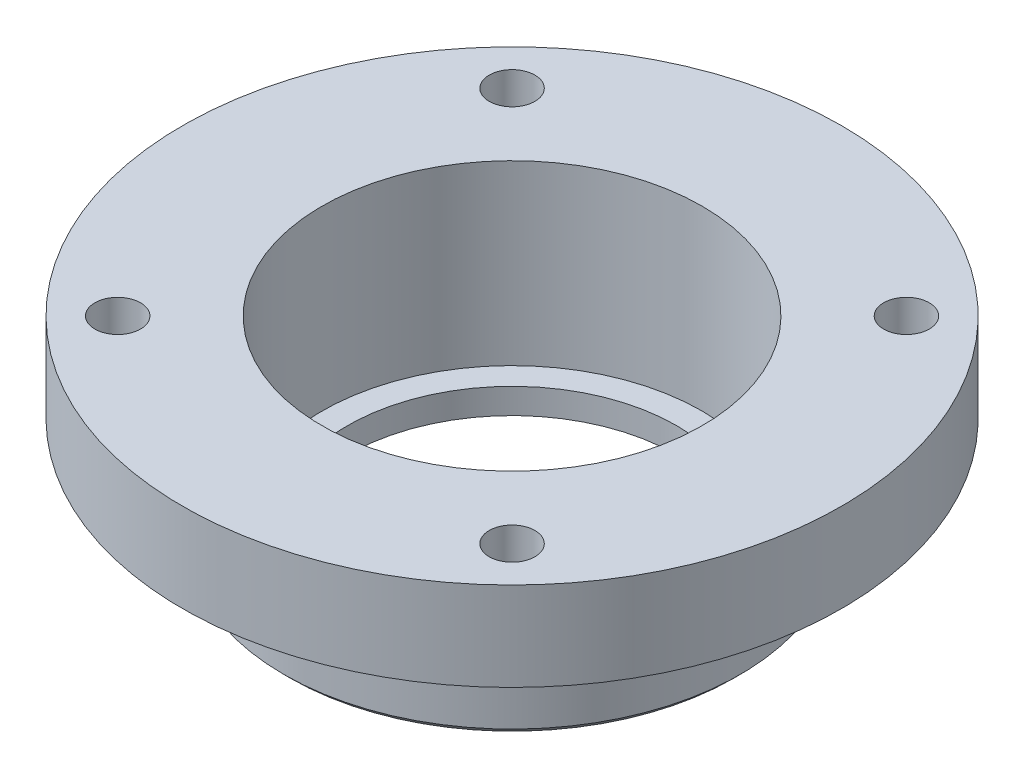
ISO-10303-21;
HEADER;
FILE_DESCRIPTION(('STEP AP214'),'2;1');
FILE_NAME('part.step','',(''),(''),'','','');
FILE_SCHEMA(('AUTOMOTIVE_DESIGN { 1 0 10303 214 1 1 1 1 }'));
ENDSEC;
DATA;
#1=APPLICATION_CONTEXT('core data for automotive mechanical design processes');
#2=APPLICATION_PROTOCOL_DEFINITION('international standard','automotive_design',2000,#1);
#3=PRODUCT_CONTEXT('',#1,'mechanical');
#4=PRODUCT('Part','Part','',(#3));
#5=PRODUCT_RELATED_PRODUCT_CATEGORY('part','',(#4));
#6=PRODUCT_DEFINITION_FORMATION('','',#4);
#7=PRODUCT_DEFINITION_CONTEXT('part definition',#1,'design');
#8=PRODUCT_DEFINITION('design','',#6,#7);
#9=PRODUCT_DEFINITION_SHAPE('','',#8);
#10=(LENGTH_UNIT() NAMED_UNIT(*) SI_UNIT(.MILLI.,.METRE.));
#11=(NAMED_UNIT(*) PLANE_ANGLE_UNIT() SI_UNIT($,.RADIAN.));
#12=(NAMED_UNIT(*) SI_UNIT($,.STERADIAN.) SOLID_ANGLE_UNIT());
#13=UNCERTAINTY_MEASURE_WITH_UNIT(LENGTH_MEASURE(1.E-05),#10,'distance_accuracy_value','');
#14=(GEOMETRIC_REPRESENTATION_CONTEXT(3) GLOBAL_UNCERTAINTY_ASSIGNED_CONTEXT((#13)) GLOBAL_UNIT_ASSIGNED_CONTEXT((#10,
#11,#12)) REPRESENTATION_CONTEXT('',''));
#15=CARTESIAN_POINT('',(0.,0.,0.));
#16=DIRECTION('',(0.,0.,1.));
#17=DIRECTION('',(1.,0.,0.));
#18=AXIS2_PLACEMENT_3D('',#15,#16,#17);
#19=CARTESIAN_POINT('',(-15.,16.,0.));
#20=DIRECTION('',(0.,-1.,0.));
#21=DIRECTION('',(0.,0.,-1.));
#22=AXIS2_PLACEMENT_3D('',#19,#20,#21);
#23=PLANE('',#22);
#24=CARTESIAN_POINT('',(15.556349186104,16.,-15.5563491861041));
#25=DIRECTION('',(0.,1.,0.));
#26=DIRECTION('',(0.,0.,1.));
#27=AXIS2_PLACEMENT_3D('',#24,#25,#26);
#28=CIRCLE('',#27,1.8);
#29=CARTESIAN_POINT('',(15.556349186104,16.,-13.7563491861041));
#30=VERTEX_POINT('',#29);
#31=EDGE_CURVE('E80',#30,#30,#28,.T.);
#32=ORIENTED_EDGE('',*,*,#31,.F.);
#33=EDGE_LOOP('',(#32));
#34=FACE_BOUND('',#33,.T.);
#35=CARTESIAN_POINT('',(15.556349186104,16.,15.5563491861041));
#36=DIRECTION('',(0.,1.,0.));
#37=DIRECTION('',(0.,0.,1.));
#38=AXIS2_PLACEMENT_3D('',#35,#36,#37);
#39=CIRCLE('',#38,1.8);
#40=CARTESIAN_POINT('',(15.556349186104,16.,17.3563491861041));
#41=VERTEX_POINT('',#40);
#42=EDGE_CURVE('E74',#41,#41,#39,.T.);
#43=ORIENTED_EDGE('',*,*,#42,.F.);
#44=EDGE_LOOP('',(#43));
#45=FACE_BOUND('',#44,.T.);
#46=CARTESIAN_POINT('',(0.,16.,0.));
#47=DIRECTION('',(0.,-1.,0.));
#48=DIRECTION('',(0.,0.,-1.));
#49=AXIS2_PLACEMENT_3D('',#46,#47,#48);
#50=CIRCLE('',#49,26.);
#51=CARTESIAN_POINT('',(0.,16.,-26.));
#52=VERTEX_POINT('',#51);
#53=EDGE_CURVE('E62',#52,#52,#50,.T.);
#54=ORIENTED_EDGE('',*,*,#53,.F.);
#55=EDGE_LOOP('',(#54));
#56=FACE_BOUND('',#55,.T.);
#57=CARTESIAN_POINT('',(0.,16.,0.));
#58=DIRECTION('',(0.,-1.,0.));
#59=DIRECTION('',(0.,0.,-1.));
#60=AXIS2_PLACEMENT_3D('',#57,#58,#59);
#61=CIRCLE('',#60,15.);
#62=CARTESIAN_POINT('',(0.,16.,-15.));
#63=VERTEX_POINT('',#62);
#64=EDGE_CURVE('E65',#63,#63,#61,.T.);
#65=ORIENTED_EDGE('',*,*,#64,.T.);
#66=EDGE_LOOP('',(#65));
#67=FACE_BOUND('',#66,.T.);
#68=CARTESIAN_POINT('',(-15.556349186104,16.,-15.5563491861041));
#69=DIRECTION('',(0.,1.,0.));
#70=DIRECTION('',(0.,0.,1.));
#71=AXIS2_PLACEMENT_3D('',#68,#69,#70);
#72=CIRCLE('',#71,1.8);
#73=CARTESIAN_POINT('',(-15.556349186104,16.,-13.7563491861041));
#74=VERTEX_POINT('',#73);
#75=EDGE_CURVE('E86',#74,#74,#72,.T.);
#76=ORIENTED_EDGE('',*,*,#75,.F.);
#77=EDGE_LOOP('',(#76));
#78=FACE_BOUND('',#77,.T.);
#79=CARTESIAN_POINT('',(-15.5563491861039,16.,15.5563491861042));
#80=DIRECTION('',(0.,1.,0.));
#81=DIRECTION('',(0.,0.,1.));
#82=AXIS2_PLACEMENT_3D('',#79,#80,#81);
#83=CIRCLE('',#82,1.8);
#84=CARTESIAN_POINT('',(-15.5563491861039,16.,17.3563491861042));
#85=VERTEX_POINT('',#84);
#86=EDGE_CURVE('E92',#85,#85,#83,.T.);
#87=ORIENTED_EDGE('',*,*,#86,.F.);
#88=EDGE_LOOP('',(#87));
#89=FACE_BOUND('',#88,.T.);
#90=ADVANCED_FACE('F35',(#34,#45,#56,#67,#78,#89),#23,.F.);
#91=CARTESIAN_POINT('',(-13.,2.,0.));
#92=DIRECTION('',(0.,-1.,0.));
#93=DIRECTION('',(0.,0.,-1.));
#94=AXIS2_PLACEMENT_3D('',#91,#92,#93);
#95=PLANE('',#94);
#96=CARTESIAN_POINT('',(0.,2.,0.));
#97=DIRECTION('',(0.,-1.,0.));
#98=DIRECTION('',(0.,0.,-1.));
#99=AXIS2_PLACEMENT_3D('',#96,#97,#98);
#100=CIRCLE('',#99,15.);
#101=CARTESIAN_POINT('',(0.,2.,-15.));
#102=VERTEX_POINT('',#101);
#103=EDGE_CURVE('E68',#102,#102,#100,.T.);
#104=ORIENTED_EDGE('',*,*,#103,.F.);
#105=EDGE_LOOP('',(#104));
#106=FACE_BOUND('',#105,.T.);
#107=CARTESIAN_POINT('',(0.,2.,0.));
#108=DIRECTION('',(0.,-1.,0.));
#109=DIRECTION('',(0.,0.,-1.));
#110=AXIS2_PLACEMENT_3D('',#107,#108,#109);
#111=CIRCLE('',#110,13.);
#112=CARTESIAN_POINT('',(0.,2.,-13.));
#113=VERTEX_POINT('',#112);
#114=EDGE_CURVE('E47',#113,#113,#111,.T.);
#115=ORIENTED_EDGE('',*,*,#114,.T.);
#116=EDGE_LOOP('',(#115));
#117=FACE_BOUND('',#116,.T.);
#118=ADVANCED_FACE('F99',(#106,#117),#95,.F.);
#119=CARTESIAN_POINT('',(0.,0.,0.));
#120=DIRECTION('',(0.,-1.,0.));
#121=DIRECTION('',(0.,0.,-1.));
#122=AXIS2_PLACEMENT_3D('',#119,#120,#121);
#123=CYLINDRICAL_SURFACE('',#122,13.);
#124=ORIENTED_EDGE('',*,*,#114,.F.);
#125=EDGE_LOOP('',(#124));
#126=FACE_BOUND('',#125,.T.);
#127=CARTESIAN_POINT('',(0.,0.,0.));
#128=DIRECTION('',(0.,-1.,0.));
#129=DIRECTION('',(0.,0.,-1.));
#130=AXIS2_PLACEMENT_3D('',#127,#128,#129);
#131=CIRCLE('',#130,13.);
#132=CARTESIAN_POINT('',(0.,0.,-13.));
#133=VERTEX_POINT('',#132);
#134=EDGE_CURVE('E51',#133,#133,#131,.T.);
#135=ORIENTED_EDGE('',*,*,#134,.T.);
#136=EDGE_LOOP('',(#135));
#137=FACE_BOUND('',#136,.T.);
#138=ADVANCED_FACE('F105',(#126,#137),#123,.F.);
#139=CARTESIAN_POINT('',(-18.,0.,0.));
#140=DIRECTION('',(0.,1.,0.));
#141=DIRECTION('',(0.,0.,1.));
#142=AXIS2_PLACEMENT_3D('',#139,#140,#141);
#143=PLANE('',#142);
#144=CARTESIAN_POINT('',(0.,0.,0.));
#145=DIRECTION('',(0.,1.,0.));
#146=DIRECTION('',(0.,0.,1.));
#147=AXIS2_PLACEMENT_3D('',#144,#145,#146);
#148=CIRCLE('',#147,17.5);
#149=CARTESIAN_POINT('',(0.,0.,17.5));
#150=VERTEX_POINT('',#149);
#151=EDGE_CURVE('E43',#150,#150,#148,.F.);
#152=ORIENTED_EDGE('',*,*,#151,.T.);
#153=EDGE_LOOP('',(#152));
#154=FACE_BOUND('',#153,.T.);
#155=ORIENTED_EDGE('',*,*,#134,.F.);
#156=EDGE_LOOP('',(#155));
#157=FACE_BOUND('',#156,.T.);
#158=ADVANCED_FACE('F124',(#154,#157),#143,.F.);
#159=CARTESIAN_POINT('',(0.,0.,0.));
#160=DIRECTION('',(0.,-1.,0.));
#161=DIRECTION('',(0.,0.,-1.));
#162=AXIS2_PLACEMENT_3D('',#159,#160,#161);
#163=CYLINDRICAL_SURFACE('',#162,18.);
#164=CARTESIAN_POINT('',(0.,0.500000000000004,0.));
#165=DIRECTION('',(0.,1.,0.));
#166=DIRECTION('',(0.,0.,1.));
#167=AXIS2_PLACEMENT_3D('',#164,#165,#166);
#168=CIRCLE('',#167,18.);
#169=CARTESIAN_POINT('',(0.,0.500000000000004,18.));
#170=VERTEX_POINT('',#169);
#171=EDGE_CURVE('E10',#170,#170,#168,.T.);
#172=ORIENTED_EDGE('',*,*,#171,.T.);
#173=EDGE_LOOP('',(#172));
#174=FACE_BOUND('',#173,.T.);
#175=CARTESIAN_POINT('',(0.,8.99999999999995,0.));
#176=DIRECTION('',(0.,-1.,0.));
#177=DIRECTION('',(0.,0.,-1.));
#178=AXIS2_PLACEMENT_3D('',#175,#176,#177);
#179=CIRCLE('',#178,18.);
#180=CARTESIAN_POINT('',(0.,8.99999999999995,-18.));
#181=VERTEX_POINT('',#180);
#182=EDGE_CURVE('E56',#181,#181,#179,.T.);
#183=ORIENTED_EDGE('',*,*,#182,.T.);
#184=EDGE_LOOP('',(#183));
#185=FACE_BOUND('',#184,.T.);
#186=ADVANCED_FACE('F120',(#174,#185),#163,.T.);
#187=CARTESIAN_POINT('',(-26.,8.99999999999995,0.));
#188=DIRECTION('',(0.,1.,0.));
#189=DIRECTION('',(0.,0.,1.));
#190=AXIS2_PLACEMENT_3D('',#187,#188,#189);
#191=PLANE('',#190);
#192=CARTESIAN_POINT('',(-15.5563491861039,8.99999999999995,15.5563491861042));
#193=DIRECTION('',(0.,1.,0.));
#194=DIRECTION('',(0.,0.,1.));
#195=AXIS2_PLACEMENT_3D('',#192,#193,#194);
#196=CIRCLE('',#195,1.8);
#197=CARTESIAN_POINT('',(-15.5563491861039,8.99999999999995,17.3563491861042));
#198=VERTEX_POINT('',#197);
#199=EDGE_CURVE('E89',#198,#198,#196,.T.);
#200=ORIENTED_EDGE('',*,*,#199,.T.);
#201=EDGE_LOOP('',(#200));
#202=FACE_BOUND('',#201,.T.);
#203=CARTESIAN_POINT('',(-15.556349186104,8.99999999999995,-15.5563491861041));
#204=DIRECTION('',(0.,1.,0.));
#205=DIRECTION('',(0.,0.,1.));
#206=AXIS2_PLACEMENT_3D('',#203,#204,#205);
#207=CIRCLE('',#206,1.8);
#208=CARTESIAN_POINT('',(-15.556349186104,8.99999999999995,-13.7563491861041));
#209=VERTEX_POINT('',#208);
#210=EDGE_CURVE('E83',#209,#209,#207,.T.);
#211=ORIENTED_EDGE('',*,*,#210,.T.);
#212=EDGE_LOOP('',(#211));
#213=FACE_BOUND('',#212,.T.);
#214=CARTESIAN_POINT('',(15.556349186104,8.99999999999995,-15.5563491861041));
#215=DIRECTION('',(0.,1.,0.));
#216=DIRECTION('',(0.,0.,1.));
#217=AXIS2_PLACEMENT_3D('',#214,#215,#216);
#218=CIRCLE('',#217,1.8);
#219=CARTESIAN_POINT('',(15.556349186104,8.99999999999995,-13.7563491861041));
#220=VERTEX_POINT('',#219);
#221=EDGE_CURVE('E77',#220,#220,#218,.T.);
#222=ORIENTED_EDGE('',*,*,#221,.T.);
#223=EDGE_LOOP('',(#222));
#224=FACE_BOUND('',#223,.T.);
#225=CARTESIAN_POINT('',(15.556349186104,8.99999999999995,15.5563491861041));
#226=DIRECTION('',(0.,1.,0.));
#227=DIRECTION('',(0.,0.,1.));
#228=AXIS2_PLACEMENT_3D('',#225,#226,#227);
#229=CIRCLE('',#228,1.8);
#230=CARTESIAN_POINT('',(15.556349186104,8.99999999999995,17.3563491861041));
#231=VERTEX_POINT('',#230);
#232=EDGE_CURVE('E71',#231,#231,#229,.T.);
#233=ORIENTED_EDGE('',*,*,#232,.T.);
#234=EDGE_LOOP('',(#233));
#235=FACE_BOUND('',#234,.T.);
#236=ORIENTED_EDGE('',*,*,#182,.F.);
#237=EDGE_LOOP('',(#236));
#238=FACE_BOUND('',#237,.T.);
#239=CARTESIAN_POINT('',(0.,8.99999999999995,0.));
#240=DIRECTION('',(0.,-1.,0.));
#241=DIRECTION('',(0.,0.,-1.));
#242=AXIS2_PLACEMENT_3D('',#239,#240,#241);
#243=CIRCLE('',#242,26.);
#244=CARTESIAN_POINT('',(0.,8.99999999999995,-26.));
#245=VERTEX_POINT('',#244);
#246=EDGE_CURVE('E59',#245,#245,#243,.T.);
#247=ORIENTED_EDGE('',*,*,#246,.T.);
#248=EDGE_LOOP('',(#247));
#249=FACE_BOUND('',#248,.T.);
#250=ADVANCED_FACE('F116',(#202,#213,#224,#235,#238,#249),#191,.F.);
#251=CARTESIAN_POINT('',(0.,0.,0.));
#252=DIRECTION('',(0.,-1.,0.));
#253=DIRECTION('',(0.,0.,-1.));
#254=AXIS2_PLACEMENT_3D('',#251,#252,#253);
#255=CYLINDRICAL_SURFACE('',#254,26.);
#256=ORIENTED_EDGE('',*,*,#246,.F.);
#257=EDGE_LOOP('',(#256));
#258=FACE_BOUND('',#257,.T.);
#259=ORIENTED_EDGE('',*,*,#53,.T.);
#260=EDGE_LOOP('',(#259));
#261=FACE_BOUND('',#260,.T.);
#262=ADVANCED_FACE('F113',(#258,#261),#255,.T.);
#263=CARTESIAN_POINT('',(0.,0.,0.));
#264=DIRECTION('',(0.,-1.,0.));
#265=DIRECTION('',(0.,0.,-1.));
#266=AXIS2_PLACEMENT_3D('',#263,#264,#265);
#267=CYLINDRICAL_SURFACE('',#266,15.);
#268=ORIENTED_EDGE('',*,*,#64,.F.);
#269=EDGE_LOOP('',(#268));
#270=FACE_BOUND('',#269,.T.);
#271=ORIENTED_EDGE('',*,*,#103,.T.);
#272=EDGE_LOOP('',(#271));
#273=FACE_BOUND('',#272,.T.);
#274=ADVANCED_FACE('F111',(#270,#273),#267,.F.);
#275=CARTESIAN_POINT('',(0.,0.,0.));
#276=DIRECTION('',(0.,1.,0.));
#277=DIRECTION('',(0.,0.,1.));
#278=AXIS2_PLACEMENT_3D('',#275,#276,#277);
#279=CONICAL_SURFACE('',#278,17.5,0.785398163397434);
#280=ORIENTED_EDGE('',*,*,#171,.F.);
#281=EDGE_LOOP('',(#280));
#282=FACE_BOUND('',#281,.T.);
#283=ORIENTED_EDGE('',*,*,#151,.F.);
#284=EDGE_LOOP('',(#283));
#285=FACE_BOUND('',#284,.T.);
#286=ADVANCED_FACE('F38',(#282,#285),#279,.T.);
#287=CARTESIAN_POINT('',(15.556349186104,16.,15.5563491861041));
#288=DIRECTION('',(0.,1.,0.));
#289=DIRECTION('',(0.,0.,1.));
#290=AXIS2_PLACEMENT_3D('',#287,#288,#289);
#291=CYLINDRICAL_SURFACE('',#290,1.8);
#292=ORIENTED_EDGE('',*,*,#232,.F.);
#293=EDGE_LOOP('',(#292));
#294=FACE_BOUND('',#293,.T.);
#295=ORIENTED_EDGE('',*,*,#42,.T.);
#296=EDGE_LOOP('',(#295));
#297=FACE_BOUND('',#296,.T.);
#298=ADVANCED_FACE('F167',(#294,#297),#291,.F.);
#299=CARTESIAN_POINT('',(15.556349186104,16.,-15.5563491861041));
#300=DIRECTION('',(0.,1.,0.));
#301=DIRECTION('',(0.,0.,1.));
#302=AXIS2_PLACEMENT_3D('',#299,#300,#301);
#303=CYLINDRICAL_SURFACE('',#302,1.8);
#304=ORIENTED_EDGE('',*,*,#221,.F.);
#305=EDGE_LOOP('',(#304));
#306=FACE_BOUND('',#305,.T.);
#307=ORIENTED_EDGE('',*,*,#31,.T.);
#308=EDGE_LOOP('',(#307));
#309=FACE_BOUND('',#308,.T.);
#310=ADVANCED_FACE('F174',(#306,#309),#303,.F.);
#311=CARTESIAN_POINT('',(-15.556349186104,16.,-15.5563491861041));
#312=DIRECTION('',(0.,1.,0.));
#313=DIRECTION('',(0.,0.,1.));
#314=AXIS2_PLACEMENT_3D('',#311,#312,#313);
#315=CYLINDRICAL_SURFACE('',#314,1.8);
#316=ORIENTED_EDGE('',*,*,#210,.F.);
#317=EDGE_LOOP('',(#316));
#318=FACE_BOUND('',#317,.T.);
#319=ORIENTED_EDGE('',*,*,#75,.T.);
#320=EDGE_LOOP('',(#319));
#321=FACE_BOUND('',#320,.T.);
#322=ADVANCED_FACE('F180',(#318,#321),#315,.F.);
#323=CARTESIAN_POINT('',(-15.5563491861039,16.,15.5563491861042));
#324=DIRECTION('',(0.,1.,0.));
#325=DIRECTION('',(0.,0.,1.));
#326=AXIS2_PLACEMENT_3D('',#323,#324,#325);
#327=CYLINDRICAL_SURFACE('',#326,1.8);
#328=ORIENTED_EDGE('',*,*,#199,.F.);
#329=EDGE_LOOP('',(#328));
#330=FACE_BOUND('',#329,.T.);
#331=ORIENTED_EDGE('',*,*,#86,.T.);
#332=EDGE_LOOP('',(#331));
#333=FACE_BOUND('',#332,.T.);
#334=ADVANCED_FACE('F96',(#330,#333),#327,.F.);
#335=CLOSED_SHELL('',(#90,#118,#138,#158,#186,#250,#262,#274,#286,#298,#310,#322,#334));
#336=MANIFOLD_SOLID_BREP('B2',#335);
#337=ADVANCED_BREP_SHAPE_REPRESENTATION('',(#18,#336),#14);
#338=SHAPE_DEFINITION_REPRESENTATION(#9,#337);
ENDSEC;
END-ISO-10303-21;
